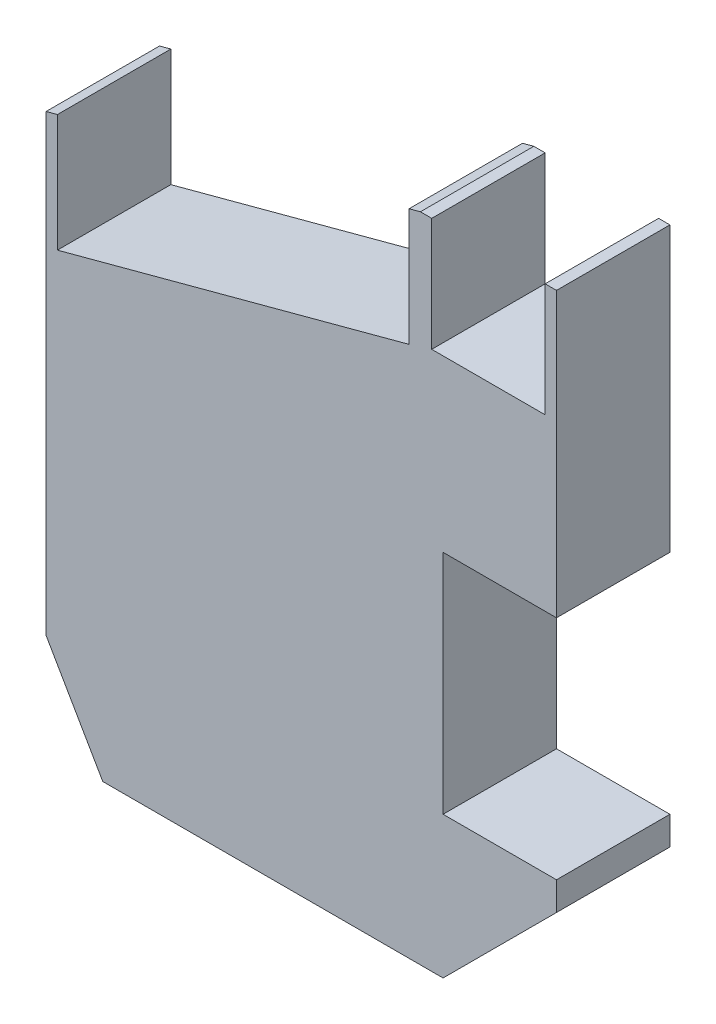
ISO-10303-21;
HEADER;
FILE_DESCRIPTION(('STEP AP214'),'2;1');
FILE_NAME('part.step','',(''),(''),'','','');
FILE_SCHEMA(('AUTOMOTIVE_DESIGN { 1 0 10303 214 1 1 1 1 }'));
ENDSEC;
DATA;
#1=APPLICATION_CONTEXT('core data for automotive mechanical design processes');
#2=APPLICATION_PROTOCOL_DEFINITION('international standard','automotive_design',2000,#1);
#3=PRODUCT_CONTEXT('',#1,'mechanical');
#4=PRODUCT('Part','Part','',(#3));
#5=PRODUCT_RELATED_PRODUCT_CATEGORY('part','',(#4));
#6=PRODUCT_DEFINITION_FORMATION('','',#4);
#7=PRODUCT_DEFINITION_CONTEXT('part definition',#1,'design');
#8=PRODUCT_DEFINITION('design','',#6,#7);
#9=PRODUCT_DEFINITION_SHAPE('','',#8);
#10=(LENGTH_UNIT() NAMED_UNIT(*) SI_UNIT(.MILLI.,.METRE.));
#11=(NAMED_UNIT(*) PLANE_ANGLE_UNIT() SI_UNIT($,.RADIAN.));
#12=(NAMED_UNIT(*) SI_UNIT($,.STERADIAN.) SOLID_ANGLE_UNIT());
#13=UNCERTAINTY_MEASURE_WITH_UNIT(LENGTH_MEASURE(1.E-05),#10,'distance_accuracy_value','');
#14=(GEOMETRIC_REPRESENTATION_CONTEXT(3) GLOBAL_UNCERTAINTY_ASSIGNED_CONTEXT((#13)) GLOBAL_UNIT_ASSIGNED_CONTEXT((#10,
#11,#12)) REPRESENTATION_CONTEXT('',''));
#15=CARTESIAN_POINT('',(0.,0.,0.));
#16=DIRECTION('',(0.,0.,1.));
#17=DIRECTION('',(1.,0.,0.));
#18=AXIS2_PLACEMENT_3D('',#15,#16,#17);
#19=CARTESIAN_POINT('',(0.,0.,20.));
#20=DIRECTION('',(0.,0.,1.));
#21=DIRECTION('',(1.,0.,0.));
#22=AXIS2_PLACEMENT_3D('',#19,#20,#21);
#23=PLANE('',#22);
#24=DIRECTION('',(0.965925826289068,0.258819045102521,0.));
#25=VECTOR('',#24,1.);
#26=CARTESIAN_POINT('',(-24.9987113059643,93.2964607176053,20.));
#27=LINE('',#26,#25);
#28=CARTESIAN_POINT('',(53.9999999999999,114.464101615138,20.));
#29=VERTEX_POINT('',#28);
#30=CARTESIAN_POINT('',(55.9999999999999,115.,20.));
#31=VERTEX_POINT('',#30);
#32=EDGE_CURVE('E263',#29,#31,#27,.T.);
#33=ORIENTED_EDGE('',*,*,#32,.F.);
#34=DIRECTION('',(0.,-1.,0.));
#35=VECTOR('',#34,1.);
#36=CARTESIAN_POINT('',(54.,0.,20.));
#37=LINE('',#36,#35);
#38=CARTESIAN_POINT('',(53.9999999999999,93.7585780069361,20.));
#39=VERTEX_POINT('',#38);
#40=EDGE_CURVE('E208',#29,#39,#37,.T.);
#41=ORIENTED_EDGE('',*,*,#40,.T.);
#42=DIRECTION('',(-0.965925826289068,-0.258819045102521,0.));
#43=VECTOR('',#42,1.);
#44=CARTESIAN_POINT('',(-19.8223304039139,73.9779441918239,20.));
#45=LINE('',#44,#43);
#46=CARTESIAN_POINT('',(-8.00000000000008,77.1457280762065,20.));
#47=VERTEX_POINT('',#46);
#48=EDGE_CURVE('E174',#39,#47,#45,.T.);
#49=ORIENTED_EDGE('',*,*,#48,.T.);
#50=DIRECTION('',(0.,1.,0.));
#51=VECTOR('',#50,1.);
#52=CARTESIAN_POINT('',(-8.00000000000007,0.,20.));
#53=LINE('',#52,#51);
#54=CARTESIAN_POINT('',(-8.00000000000008,97.8512516844082,20.));
#55=VERTEX_POINT('',#54);
#56=EDGE_CURVE('E177',#47,#55,#53,.T.);
#57=ORIENTED_EDGE('',*,*,#56,.T.);
#58=CARTESIAN_POINT('',(-10.0000000000001,97.3153532995459,20.));
#59=VERTEX_POINT('',#58);
#60=EDGE_CURVE('E264',#59,#55,#27,.T.);
#61=ORIENTED_EDGE('',*,*,#60,.F.);
#62=DIRECTION('',(0.,-1.,0.));
#63=VECTOR('',#62,1.);
#64=CARTESIAN_POINT('',(-10.0000000000001,0.,20.));
#65=LINE('',#64,#63);
#66=CARTESIAN_POINT('',(-10.0000000000001,17.3153532995459,20.));
#67=VERTEX_POINT('',#66);
#68=EDGE_CURVE('E245',#59,#67,#65,.T.);
#69=ORIENTED_EDGE('',*,*,#68,.T.);
#70=DIRECTION('',(0.5001116249392,-0.865960947503219,0.));
#71=VECTOR('',#70,1.);
#72=CARTESIAN_POINT('',(0.,0.,20.));
#73=LINE('',#72,#71);
#74=CARTESIAN_POINT('',(0.,0.,20.));
#75=VERTEX_POINT('',#74);
#76=EDGE_CURVE('E248',#67,#75,#73,.T.);
#77=ORIENTED_EDGE('',*,*,#76,.T.);
#78=DIRECTION('',(1.,0.,0.));
#79=VECTOR('',#78,1.);
#80=CARTESIAN_POINT('',(0.,0.,20.));
#81=LINE('',#80,#79);
#82=CARTESIAN_POINT('',(60.,0.,20.));
#83=VERTEX_POINT('',#82);
#84=EDGE_CURVE('E251',#75,#83,#81,.T.);
#85=ORIENTED_EDGE('',*,*,#84,.T.);
#86=DIRECTION('',(0.707106781186546,0.707106781186549,0.));
#87=VECTOR('',#86,1.);
#88=CARTESIAN_POINT('',(30.0000000000001,-30.,20.));
#89=LINE('',#88,#87);
#90=CARTESIAN_POINT('',(79.9999999999999,20.,20.));
#91=VERTEX_POINT('',#90);
#92=EDGE_CURVE('E253',#83,#91,#89,.T.);
#93=ORIENTED_EDGE('',*,*,#92,.T.);
#94=DIRECTION('',(0.,1.,0.));
#95=VECTOR('',#94,1.);
#96=CARTESIAN_POINT('',(79.9999999999999,0.,20.));
#97=LINE('',#96,#95);
#98=CARTESIAN_POINT('',(79.9999999999999,25.,20.));
#99=VERTEX_POINT('',#98);
#100=EDGE_CURVE('E256',#91,#99,#97,.T.);
#101=ORIENTED_EDGE('',*,*,#100,.T.);
#102=DIRECTION('',(1.,0.,0.));
#103=VECTOR('',#102,1.);
#104=CARTESIAN_POINT('',(0.,25.,20.));
#105=LINE('',#104,#103);
#106=CARTESIAN_POINT('',(59.9999999999999,25.,20.));
#107=VERTEX_POINT('',#106);
#108=EDGE_CURVE('E50',#107,#99,#105,.T.);
#109=ORIENTED_EDGE('',*,*,#108,.F.);
#110=DIRECTION('',(0.,-1.,0.));
#111=VECTOR('',#110,1.);
#112=CARTESIAN_POINT('',(59.9999999999999,0.,20.));
#113=LINE('',#112,#111);
#114=CARTESIAN_POINT('',(59.9999999999999,65.,20.));
#115=VERTEX_POINT('',#114);
#116=EDGE_CURVE('E213',#115,#107,#113,.T.);
#117=ORIENTED_EDGE('',*,*,#116,.F.);
#118=DIRECTION('',(-1.,0.,0.));
#119=VECTOR('',#118,1.);
#120=CARTESIAN_POINT('',(0.,65.,20.));
#121=LINE('',#120,#119);
#122=CARTESIAN_POINT('',(79.9999999999999,65.,20.));
#123=VERTEX_POINT('',#122);
#124=EDGE_CURVE('E211',#123,#115,#121,.T.);
#125=ORIENTED_EDGE('',*,*,#124,.F.);
#126=CARTESIAN_POINT('',(79.9999999999999,115.,20.));
#127=VERTEX_POINT('',#126);
#128=EDGE_CURVE('E255',#123,#127,#97,.T.);
#129=ORIENTED_EDGE('',*,*,#128,.T.);
#130=DIRECTION('',(-1.,0.,0.));
#131=VECTOR('',#130,1.);
#132=CARTESIAN_POINT('',(0.,115.,20.));
#133=LINE('',#132,#131);
#134=CARTESIAN_POINT('',(77.9999999999999,115.,20.));
#135=VERTEX_POINT('',#134);
#136=EDGE_CURVE('E260',#127,#135,#133,.T.);
#137=ORIENTED_EDGE('',*,*,#136,.T.);
#138=DIRECTION('',(0.,-1.,0.));
#139=VECTOR('',#138,1.);
#140=CARTESIAN_POINT('',(77.9999999999999,0.,20.));
#141=LINE('',#140,#139);
#142=CARTESIAN_POINT('',(77.9999999999999,95.,20.));
#143=VERTEX_POINT('',#142);
#144=EDGE_CURVE('E238',#135,#143,#141,.T.);
#145=ORIENTED_EDGE('',*,*,#144,.T.);
#146=DIRECTION('',(-1.,0.,0.));
#147=VECTOR('',#146,1.);
#148=CARTESIAN_POINT('',(0.,95.,20.));
#149=LINE('',#148,#147);
#150=CARTESIAN_POINT('',(57.9999999999999,95.,20.));
#151=VERTEX_POINT('',#150);
#152=EDGE_CURVE('E241',#143,#151,#149,.T.);
#153=ORIENTED_EDGE('',*,*,#152,.T.);
#154=DIRECTION('',(0.,1.,0.));
#155=VECTOR('',#154,1.);
#156=CARTESIAN_POINT('',(57.9999999999999,0.,20.));
#157=LINE('',#156,#155);
#158=CARTESIAN_POINT('',(57.9999999999999,115.,20.));
#159=VERTEX_POINT('',#158);
#160=EDGE_CURVE('E235',#151,#159,#157,.T.);
#161=ORIENTED_EDGE('',*,*,#160,.T.);
#162=EDGE_CURVE('E259',#159,#31,#133,.T.);
#163=ORIENTED_EDGE('',*,*,#162,.T.);
#164=EDGE_LOOP('',(#33,#41,#49,#57,#61,#69,#77,#85,#93,#101,#109,#117,#125,#129,#137,#145,#153,
#161,#163));
#165=FACE_BOUND('',#164,.T.);
#166=ADVANCED_FACE('F35',(#165),#23,.T.);
#167=CARTESIAN_POINT('',(0.,0.,0.));
#168=DIRECTION('',(0.,0.,1.));
#169=DIRECTION('',(1.,0.,0.));
#170=AXIS2_PLACEMENT_3D('',#167,#168,#169);
#171=PLANE('',#170);
#172=DIRECTION('',(0.,1.,0.));
#173=VECTOR('',#172,1.);
#174=CARTESIAN_POINT('',(54.,0.,0.));
#175=LINE('',#174,#173);
#176=CARTESIAN_POINT('',(53.9999999999999,93.7585780069361,0.));
#177=VERTEX_POINT('',#176);
#178=CARTESIAN_POINT('',(53.9999999999999,114.464101615138,0.));
#179=VERTEX_POINT('',#178);
#180=EDGE_CURVE('E181',#177,#179,#175,.T.);
#181=ORIENTED_EDGE('',*,*,#180,.T.);
#182=DIRECTION('',(0.965925826289068,0.258819045102521,0.));
#183=VECTOR('',#182,1.);
#184=CARTESIAN_POINT('',(-24.9987113059643,93.2964607176053,0.));
#185=LINE('',#184,#183);
#186=CARTESIAN_POINT('',(55.9999999999999,115.,0.));
#187=VERTEX_POINT('',#186);
#188=EDGE_CURVE('E284',#179,#187,#185,.T.);
#189=ORIENTED_EDGE('',*,*,#188,.T.);
#190=DIRECTION('',(-1.,0.,0.));
#191=VECTOR('',#190,1.);
#192=CARTESIAN_POINT('',(0.,115.,0.));
#193=LINE('',#192,#191);
#194=CARTESIAN_POINT('',(57.9999999999999,115.,0.));
#195=VERTEX_POINT('',#194);
#196=EDGE_CURVE('E280',#195,#187,#193,.T.);
#197=ORIENTED_EDGE('',*,*,#196,.F.);
#198=DIRECTION('',(0.,-1.,0.));
#199=VECTOR('',#198,1.);
#200=CARTESIAN_POINT('',(57.9999999999999,0.,0.));
#201=LINE('',#200,#199);
#202=CARTESIAN_POINT('',(57.9999999999999,95.,0.));
#203=VERTEX_POINT('',#202);
#204=EDGE_CURVE('E222',#195,#203,#201,.T.);
#205=ORIENTED_EDGE('',*,*,#204,.T.);
#206=DIRECTION('',(1.,0.,0.));
#207=VECTOR('',#206,1.);
#208=CARTESIAN_POINT('',(0.,95.,0.));
#209=LINE('',#208,#207);
#210=CARTESIAN_POINT('',(77.9999999999999,95.,0.));
#211=VERTEX_POINT('',#210);
#212=EDGE_CURVE('E216',#203,#211,#209,.T.);
#213=ORIENTED_EDGE('',*,*,#212,.T.);
#214=DIRECTION('',(0.,1.,0.));
#215=VECTOR('',#214,1.);
#216=CARTESIAN_POINT('',(77.9999999999999,0.,0.));
#217=LINE('',#216,#215);
#218=CARTESIAN_POINT('',(77.9999999999999,115.,0.));
#219=VERTEX_POINT('',#218);
#220=EDGE_CURVE('E219',#211,#219,#217,.T.);
#221=ORIENTED_EDGE('',*,*,#220,.T.);
#222=CARTESIAN_POINT('',(79.9999999999999,115.,0.));
#223=VERTEX_POINT('',#222);
#224=EDGE_CURVE('E281',#223,#219,#193,.T.);
#225=ORIENTED_EDGE('',*,*,#224,.F.);
#226=DIRECTION('',(0.,1.,0.));
#227=VECTOR('',#226,1.);
#228=CARTESIAN_POINT('',(79.9999999999999,0.,0.));
#229=LINE('',#228,#227);
#230=CARTESIAN_POINT('',(79.9999999999999,65.,0.));
#231=VERTEX_POINT('',#230);
#232=EDGE_CURVE('E276',#231,#223,#229,.T.);
#233=ORIENTED_EDGE('',*,*,#232,.F.);
#234=DIRECTION('',(1.,0.,0.));
#235=VECTOR('',#234,1.);
#236=CARTESIAN_POINT('',(0.,65.,0.));
#237=LINE('',#236,#235);
#238=CARTESIAN_POINT('',(59.9999999999999,65.,0.));
#239=VERTEX_POINT('',#238);
#240=EDGE_CURVE('E197',#239,#231,#237,.T.);
#241=ORIENTED_EDGE('',*,*,#240,.F.);
#242=DIRECTION('',(0.,1.,0.));
#243=VECTOR('',#242,1.);
#244=CARTESIAN_POINT('',(59.9999999999999,0.,0.));
#245=LINE('',#244,#243);
#246=CARTESIAN_POINT('',(59.9999999999999,25.,0.));
#247=VERTEX_POINT('',#246);
#248=EDGE_CURVE('E199',#247,#239,#245,.T.);
#249=ORIENTED_EDGE('',*,*,#248,.F.);
#250=DIRECTION('',(-1.,0.,0.));
#251=VECTOR('',#250,1.);
#252=CARTESIAN_POINT('',(0.,25.,0.));
#253=LINE('',#252,#251);
#254=CARTESIAN_POINT('',(79.9999999999999,25.,0.));
#255=VERTEX_POINT('',#254);
#256=EDGE_CURVE('E202',#255,#247,#253,.T.);
#257=ORIENTED_EDGE('',*,*,#256,.F.);
#258=CARTESIAN_POINT('',(79.9999999999999,20.,0.));
#259=VERTEX_POINT('',#258);
#260=EDGE_CURVE('E277',#259,#255,#229,.T.);
#261=ORIENTED_EDGE('',*,*,#260,.F.);
#262=DIRECTION('',(0.707106781186546,0.707106781186549,0.));
#263=VECTOR('',#262,1.);
#264=CARTESIAN_POINT('',(30.0000000000001,-30.,0.));
#265=LINE('',#264,#263);
#266=CARTESIAN_POINT('',(60.,0.,0.));
#267=VERTEX_POINT('',#266);
#268=EDGE_CURVE('E274',#267,#259,#265,.T.);
#269=ORIENTED_EDGE('',*,*,#268,.F.);
#270=DIRECTION('',(1.,0.,0.));
#271=VECTOR('',#270,1.);
#272=CARTESIAN_POINT('',(0.,0.,0.));
#273=LINE('',#272,#271);
#274=CARTESIAN_POINT('',(0.,0.,0.));
#275=VERTEX_POINT('',#274);
#276=EDGE_CURVE('E272',#275,#267,#273,.T.);
#277=ORIENTED_EDGE('',*,*,#276,.F.);
#278=DIRECTION('',(0.5001116249392,-0.865960947503219,0.));
#279=VECTOR('',#278,1.);
#280=CARTESIAN_POINT('',(0.,0.,0.));
#281=LINE('',#280,#279);
#282=CARTESIAN_POINT('',(-10.0000000000001,17.3153532995459,0.));
#283=VERTEX_POINT('',#282);
#284=EDGE_CURVE('E270',#283,#275,#281,.T.);
#285=ORIENTED_EDGE('',*,*,#284,.F.);
#286=DIRECTION('',(0.,-1.,0.));
#287=VECTOR('',#286,1.);
#288=CARTESIAN_POINT('',(-10.0000000000001,0.,0.));
#289=LINE('',#288,#287);
#290=CARTESIAN_POINT('',(-10.0000000000001,97.3153532995459,0.));
#291=VERTEX_POINT('',#290);
#292=EDGE_CURVE('E244',#291,#283,#289,.T.);
#293=ORIENTED_EDGE('',*,*,#292,.F.);
#294=CARTESIAN_POINT('',(-8.00000000000008,97.8512516844082,0.));
#295=VERTEX_POINT('',#294);
#296=EDGE_CURVE('E249',#291,#295,#185,.T.);
#297=ORIENTED_EDGE('',*,*,#296,.T.);
#298=DIRECTION('',(0.,-1.,0.));
#299=VECTOR('',#298,1.);
#300=CARTESIAN_POINT('',(-8.00000000000007,0.,0.));
#301=LINE('',#300,#299);
#302=CARTESIAN_POINT('',(-8.00000000000008,77.1457280762065,0.));
#303=VERTEX_POINT('',#302);
#304=EDGE_CURVE('E58',#295,#303,#301,.T.);
#305=ORIENTED_EDGE('',*,*,#304,.T.);
#306=DIRECTION('',(0.965925826289068,0.258819045102521,0.));
#307=VECTOR('',#306,1.);
#308=CARTESIAN_POINT('',(-19.8223304039139,73.9779441918239,0.));
#309=LINE('',#308,#307);
#310=EDGE_CURVE('E172',#303,#177,#309,.T.);
#311=ORIENTED_EDGE('',*,*,#310,.T.);
#312=EDGE_LOOP('',(#181,#189,#197,#205,#213,#221,#225,#233,#241,#249,#257,#261,#269,#277,#285,
#293,#297,#305,#311));
#313=FACE_BOUND('',#312,.T.);
#314=ADVANCED_FACE('F188',(#313),#171,.F.);
#315=CARTESIAN_POINT('',(79.9999999999999,0.,20.));
#316=DIRECTION('',(-1.,0.,0.));
#317=DIRECTION('',(0.,0.,1.));
#318=AXIS2_PLACEMENT_3D('',#315,#316,#317);
#319=PLANE('',#318);
#320=ORIENTED_EDGE('',*,*,#128,.F.);
#321=DIRECTION('',(0.,0.,-1.));
#322=VECTOR('',#321,1.);
#323=CARTESIAN_POINT('',(79.9999999999999,65.,20.));
#324=LINE('',#323,#322);
#325=EDGE_CURVE('E11',#123,#231,#324,.T.);
#326=ORIENTED_EDGE('',*,*,#325,.T.);
#327=ORIENTED_EDGE('',*,*,#232,.T.);
#328=DIRECTION('',(0.,0.,-1.));
#329=VECTOR('',#328,1.);
#330=CARTESIAN_POINT('',(79.9999999999999,115.,20.));
#331=LINE('',#330,#329);
#332=EDGE_CURVE('E290',#127,#223,#331,.T.);
#333=ORIENTED_EDGE('',*,*,#332,.F.);
#334=EDGE_LOOP('',(#320,#326,#327,#333));
#335=FACE_BOUND('',#334,.T.);
#336=ADVANCED_FACE('F334',(#335),#319,.F.);
#337=CARTESIAN_POINT('',(-24.9987113059643,93.2964607176053,20.));
#338=DIRECTION('',(-0.258819045102521,0.965925826289068,0.));
#339=DIRECTION('',(-0.965925826289068,-0.258819045102521,0.));
#340=AXIS2_PLACEMENT_3D('',#337,#338,#339);
#341=PLANE('',#340);
#342=ORIENTED_EDGE('',*,*,#188,.F.);
#343=DIRECTION('',(0.,0.,1.));
#344=VECTOR('',#343,1.);
#345=CARTESIAN_POINT('',(53.9999999999999,114.464101615138,20.));
#346=LINE('',#345,#344);
#347=EDGE_CURVE('E184',#179,#29,#346,.T.);
#348=ORIENTED_EDGE('',*,*,#347,.T.);
#349=ORIENTED_EDGE('',*,*,#32,.T.);
#350=DIRECTION('',(0.,0.,-1.));
#351=VECTOR('',#350,1.);
#352=CARTESIAN_POINT('',(55.9999999999999,115.,20.));
#353=LINE('',#352,#351);
#354=EDGE_CURVE('E287',#31,#187,#353,.T.);
#355=ORIENTED_EDGE('',*,*,#354,.T.);
#356=EDGE_LOOP('',(#342,#348,#349,#355));
#357=FACE_BOUND('',#356,.T.);
#358=ADVANCED_FACE('F357',(#357),#341,.T.);
#359=ORIENTED_EDGE('',*,*,#60,.T.);
#360=DIRECTION('',(0.,0.,-1.));
#361=VECTOR('',#360,1.);
#362=CARTESIAN_POINT('',(-8.00000000000008,97.8512516844082,20.));
#363=LINE('',#362,#361);
#364=EDGE_CURVE('E305',#55,#295,#363,.T.);
#365=ORIENTED_EDGE('',*,*,#364,.T.);
#366=ORIENTED_EDGE('',*,*,#296,.F.);
#367=DIRECTION('',(0.,0.,-1.));
#368=VECTOR('',#367,1.);
#369=CARTESIAN_POINT('',(-10.0000000000001,97.3153532995459,20.));
#370=LINE('',#369,#368);
#371=EDGE_CURVE('E267',#59,#291,#370,.T.);
#372=ORIENTED_EDGE('',*,*,#371,.F.);
#373=EDGE_LOOP('',(#359,#365,#366,#372));
#374=FACE_BOUND('',#373,.T.);
#375=ADVANCED_FACE('F361',(#374),#341,.T.);
#376=CARTESIAN_POINT('',(0.,115.,20.));
#377=DIRECTION('',(0.,-1.,0.));
#378=DIRECTION('',(0.,0.,-1.));
#379=AXIS2_PLACEMENT_3D('',#376,#377,#378);
#380=PLANE('',#379);
#381=DIRECTION('',(0.,0.,-1.));
#382=VECTOR('',#381,1.);
#383=CARTESIAN_POINT('',(77.9999999999999,115.,20.000012));
#384=LINE('',#383,#382);
#385=EDGE_CURVE('E231',#135,#219,#384,.T.);
#386=ORIENTED_EDGE('',*,*,#385,.F.);
#387=ORIENTED_EDGE('',*,*,#136,.F.);
#388=ORIENTED_EDGE('',*,*,#332,.T.);
#389=ORIENTED_EDGE('',*,*,#224,.T.);
#390=EDGE_LOOP('',(#386,#387,#388,#389));
#391=FACE_BOUND('',#390,.T.);
#392=ADVANCED_FACE('F340',(#391),#380,.F.);
#393=DIRECTION('',(0.,0.,-1.));
#394=VECTOR('',#393,1.);
#395=CARTESIAN_POINT('',(57.9999999999999,115.,20.000012));
#396=LINE('',#395,#394);
#397=EDGE_CURVE('E228',#159,#195,#396,.T.);
#398=ORIENTED_EDGE('',*,*,#397,.T.);
#399=ORIENTED_EDGE('',*,*,#196,.T.);
#400=ORIENTED_EDGE('',*,*,#354,.F.);
#401=ORIENTED_EDGE('',*,*,#162,.F.);
#402=EDGE_LOOP('',(#398,#399,#400,#401));
#403=FACE_BOUND('',#402,.T.);
#404=ADVANCED_FACE('F354',(#403),#380,.F.);
#405=CARTESIAN_POINT('',(-10.0000000000001,0.,20.));
#406=DIRECTION('',(1.,0.,0.));
#407=DIRECTION('',(0.,1.,0.));
#408=AXIS2_PLACEMENT_3D('',#405,#406,#407);
#409=PLANE('',#408);
#410=ORIENTED_EDGE('',*,*,#292,.T.);
#411=DIRECTION('',(0.,0.,-1.));
#412=VECTOR('',#411,1.);
#413=CARTESIAN_POINT('',(-10.0000000000001,17.3153532995459,20.));
#414=LINE('',#413,#412);
#415=EDGE_CURVE('E302',#67,#283,#414,.T.);
#416=ORIENTED_EDGE('',*,*,#415,.F.);
#417=ORIENTED_EDGE('',*,*,#68,.F.);
#418=ORIENTED_EDGE('',*,*,#371,.T.);
#419=EDGE_LOOP('',(#410,#416,#417,#418));
#420=FACE_BOUND('',#419,.T.);
#421=ADVANCED_FACE('F37',(#420),#409,.F.);
#422=CARTESIAN_POINT('',(0.,0.,20.));
#423=DIRECTION('',(0.865960947503219,0.5001116249392,0.));
#424=DIRECTION('',(-0.5001116249392,0.865960947503219,0.));
#425=AXIS2_PLACEMENT_3D('',#422,#423,#424);
#426=PLANE('',#425);
#427=ORIENTED_EDGE('',*,*,#284,.T.);
#428=DIRECTION('',(0.,0.,-1.));
#429=VECTOR('',#428,1.);
#430=CARTESIAN_POINT('',(0.,0.,20.));
#431=LINE('',#430,#429);
#432=EDGE_CURVE('E299',#75,#275,#431,.T.);
#433=ORIENTED_EDGE('',*,*,#432,.F.);
#434=ORIENTED_EDGE('',*,*,#76,.F.);
#435=ORIENTED_EDGE('',*,*,#415,.T.);
#436=EDGE_LOOP('',(#427,#433,#434,#435));
#437=FACE_BOUND('',#436,.T.);
#438=ADVANCED_FACE('F369',(#437),#426,.F.);
#439=CARTESIAN_POINT('',(0.,0.,20.));
#440=DIRECTION('',(0.,1.,0.));
#441=DIRECTION('',(0.,0.,1.));
#442=AXIS2_PLACEMENT_3D('',#439,#440,#441);
#443=PLANE('',#442);
#444=ORIENTED_EDGE('',*,*,#276,.T.);
#445=DIRECTION('',(0.,0.,-1.));
#446=VECTOR('',#445,1.);
#447=CARTESIAN_POINT('',(60.,0.,20.));
#448=LINE('',#447,#446);
#449=EDGE_CURVE('E296',#83,#267,#448,.T.);
#450=ORIENTED_EDGE('',*,*,#449,.F.);
#451=ORIENTED_EDGE('',*,*,#84,.F.);
#452=ORIENTED_EDGE('',*,*,#432,.T.);
#453=EDGE_LOOP('',(#444,#450,#451,#452));
#454=FACE_BOUND('',#453,.T.);
#455=ADVANCED_FACE('F371',(#454),#443,.F.);
#456=CARTESIAN_POINT('',(30.0000000000001,-30.,20.));
#457=DIRECTION('',(-0.707106781186549,0.707106781186546,0.));
#458=DIRECTION('',(-0.707106781186546,-0.707106781186549,0.));
#459=AXIS2_PLACEMENT_3D('',#456,#457,#458);
#460=PLANE('',#459);
#461=ORIENTED_EDGE('',*,*,#268,.T.);
#462=DIRECTION('',(0.,0.,-1.));
#463=VECTOR('',#462,1.);
#464=CARTESIAN_POINT('',(79.9999999999999,20.,20.));
#465=LINE('',#464,#463);
#466=EDGE_CURVE('E293',#91,#259,#465,.T.);
#467=ORIENTED_EDGE('',*,*,#466,.F.);
#468=ORIENTED_EDGE('',*,*,#92,.F.);
#469=ORIENTED_EDGE('',*,*,#449,.T.);
#470=EDGE_LOOP('',(#461,#467,#468,#469));
#471=FACE_BOUND('',#470,.T.);
#472=ADVANCED_FACE('F320',(#471),#460,.F.);
#473=ORIENTED_EDGE('',*,*,#260,.T.);
#474=DIRECTION('',(0.,0.,1.));
#475=VECTOR('',#474,1.);
#476=CARTESIAN_POINT('',(79.9999999999999,25.,20.));
#477=LINE('',#476,#475);
#478=EDGE_CURVE('E43',#255,#99,#477,.T.);
#479=ORIENTED_EDGE('',*,*,#478,.T.);
#480=ORIENTED_EDGE('',*,*,#100,.F.);
#481=ORIENTED_EDGE('',*,*,#466,.T.);
#482=EDGE_LOOP('',(#473,#479,#480,#481));
#483=FACE_BOUND('',#482,.T.);
#484=ADVANCED_FACE('F309',(#483),#319,.F.);
#485=CARTESIAN_POINT('',(0.,95.,20.000012));
#486=DIRECTION('',(0.,1.,0.));
#487=DIRECTION('',(0.,0.,1.));
#488=AXIS2_PLACEMENT_3D('',#485,#486,#487);
#489=PLANE('',#488);
#490=DIRECTION('',(0.,0.,-1.));
#491=VECTOR('',#490,1.);
#492=CARTESIAN_POINT('',(77.9999999999999,95.,20.000012));
#493=LINE('',#492,#491);
#494=EDGE_CURVE('E233',#143,#211,#493,.T.);
#495=ORIENTED_EDGE('',*,*,#494,.T.);
#496=ORIENTED_EDGE('',*,*,#212,.F.);
#497=DIRECTION('',(0.,0.,-1.));
#498=VECTOR('',#497,1.);
#499=CARTESIAN_POINT('',(57.9999999999999,95.,20.000012));
#500=LINE('',#499,#498);
#501=EDGE_CURVE('E225',#151,#203,#500,.T.);
#502=ORIENTED_EDGE('',*,*,#501,.F.);
#503=ORIENTED_EDGE('',*,*,#152,.F.);
#504=EDGE_LOOP('',(#495,#496,#502,#503));
#505=FACE_BOUND('',#504,.T.);
#506=ADVANCED_FACE('F346',(#505),#489,.T.);
#507=CARTESIAN_POINT('',(77.9999999999999,0.,20.000012));
#508=DIRECTION('',(-1.,0.,0.));
#509=DIRECTION('',(0.,0.,1.));
#510=AXIS2_PLACEMENT_3D('',#507,#508,#509);
#511=PLANE('',#510);
#512=ORIENTED_EDGE('',*,*,#385,.T.);
#513=ORIENTED_EDGE('',*,*,#220,.F.);
#514=ORIENTED_EDGE('',*,*,#494,.F.);
#515=ORIENTED_EDGE('',*,*,#144,.F.);
#516=EDGE_LOOP('',(#512,#513,#514,#515));
#517=FACE_BOUND('',#516,.T.);
#518=ADVANCED_FACE('F343',(#517),#511,.T.);
#519=CARTESIAN_POINT('',(57.9999999999999,0.,20.000012));
#520=DIRECTION('',(1.,0.,0.));
#521=DIRECTION('',(0.,0.,-1.));
#522=AXIS2_PLACEMENT_3D('',#519,#520,#521);
#523=PLANE('',#522);
#524=ORIENTED_EDGE('',*,*,#501,.T.);
#525=ORIENTED_EDGE('',*,*,#204,.F.);
#526=ORIENTED_EDGE('',*,*,#397,.F.);
#527=ORIENTED_EDGE('',*,*,#160,.F.);
#528=EDGE_LOOP('',(#524,#525,#526,#527));
#529=FACE_BOUND('',#528,.T.);
#530=ADVANCED_FACE('F349',(#529),#523,.T.);
#531=CARTESIAN_POINT('',(-19.8223304039139,73.9779441918239,20.000012));
#532=DIRECTION('',(-0.258819045102521,0.965925826289068,0.));
#533=DIRECTION('',(-0.965925826289068,-0.258819045102521,0.));
#534=AXIS2_PLACEMENT_3D('',#531,#532,#533);
#535=PLANE('',#534);
#536=DIRECTION('',(0.,0.,-1.));
#537=VECTOR('',#536,1.);
#538=CARTESIAN_POINT('',(53.9999999999999,93.7585780069361,20.000012));
#539=LINE('',#538,#537);
#540=EDGE_CURVE('E167',#39,#177,#539,.T.);
#541=ORIENTED_EDGE('',*,*,#540,.T.);
#542=ORIENTED_EDGE('',*,*,#310,.F.);
#543=DIRECTION('',(0.,0.,-1.));
#544=VECTOR('',#543,1.);
#545=CARTESIAN_POINT('',(-8.00000000000008,77.1457280762065,20.000012));
#546=LINE('',#545,#544);
#547=EDGE_CURVE('E178',#47,#303,#546,.T.);
#548=ORIENTED_EDGE('',*,*,#547,.F.);
#549=ORIENTED_EDGE('',*,*,#48,.F.);
#550=EDGE_LOOP('',(#541,#542,#548,#549));
#551=FACE_BOUND('',#550,.T.);
#552=ADVANCED_FACE('F169',(#551),#535,.T.);
#553=CARTESIAN_POINT('',(54.,0.,20.000012));
#554=DIRECTION('',(-1.,0.,0.));
#555=DIRECTION('',(0.,-1.,0.));
#556=AXIS2_PLACEMENT_3D('',#553,#554,#555);
#557=PLANE('',#556);
#558=ORIENTED_EDGE('',*,*,#347,.F.);
#559=ORIENTED_EDGE('',*,*,#180,.F.);
#560=ORIENTED_EDGE('',*,*,#540,.F.);
#561=ORIENTED_EDGE('',*,*,#40,.F.);
#562=EDGE_LOOP('',(#558,#559,#560,#561));
#563=FACE_BOUND('',#562,.T.);
#564=ADVANCED_FACE('F182',(#563),#557,.T.);
#565=CARTESIAN_POINT('',(-8.00000000000007,0.,20.000012));
#566=DIRECTION('',(1.,0.,0.));
#567=DIRECTION('',(0.,1.,0.));
#568=AXIS2_PLACEMENT_3D('',#565,#566,#567);
#569=PLANE('',#568);
#570=ORIENTED_EDGE('',*,*,#547,.T.);
#571=ORIENTED_EDGE('',*,*,#304,.F.);
#572=ORIENTED_EDGE('',*,*,#364,.F.);
#573=ORIENTED_EDGE('',*,*,#56,.F.);
#574=EDGE_LOOP('',(#570,#571,#572,#573));
#575=FACE_BOUND('',#574,.T.);
#576=ADVANCED_FACE('F498',(#575),#569,.T.);
#577=CARTESIAN_POINT('',(0.,65.,20.000012));
#578=DIRECTION('',(0.,1.,0.));
#579=DIRECTION('',(0.,0.,1.));
#580=AXIS2_PLACEMENT_3D('',#577,#578,#579);
#581=PLANE('',#580);
#582=ORIENTED_EDGE('',*,*,#124,.T.);
#583=DIRECTION('',(0.,0.,-1.));
#584=VECTOR('',#583,1.);
#585=CARTESIAN_POINT('',(59.9999999999999,65.,20.000012));
#586=LINE('',#585,#584);
#587=EDGE_CURVE('E190',#115,#239,#586,.T.);
#588=ORIENTED_EDGE('',*,*,#587,.T.);
#589=ORIENTED_EDGE('',*,*,#240,.T.);
#590=ORIENTED_EDGE('',*,*,#325,.F.);
#591=EDGE_LOOP('',(#582,#588,#589,#590));
#592=FACE_BOUND('',#591,.T.);
#593=ADVANCED_FACE('F507',(#592),#581,.F.);
#594=CARTESIAN_POINT('',(59.9999999999999,0.,20.000012));
#595=DIRECTION('',(-1.,0.,0.));
#596=DIRECTION('',(0.,0.,1.));
#597=AXIS2_PLACEMENT_3D('',#594,#595,#596);
#598=PLANE('',#597);
#599=ORIENTED_EDGE('',*,*,#116,.T.);
#600=DIRECTION('',(0.,0.,-1.));
#601=VECTOR('',#600,1.);
#602=CARTESIAN_POINT('',(59.9999999999999,25.,20.000012));
#603=LINE('',#602,#601);
#604=EDGE_CURVE('E192',#107,#247,#603,.T.);
#605=ORIENTED_EDGE('',*,*,#604,.T.);
#606=ORIENTED_EDGE('',*,*,#248,.T.);
#607=ORIENTED_EDGE('',*,*,#587,.F.);
#608=EDGE_LOOP('',(#599,#605,#606,#607));
#609=FACE_BOUND('',#608,.T.);
#610=ADVANCED_FACE('F327',(#609),#598,.F.);
#611=CARTESIAN_POINT('',(0.,25.,20.000012));
#612=DIRECTION('',(0.,-1.,0.));
#613=DIRECTION('',(1.,0.,0.));
#614=AXIS2_PLACEMENT_3D('',#611,#612,#613);
#615=PLANE('',#614);
#616=ORIENTED_EDGE('',*,*,#108,.T.);
#617=ORIENTED_EDGE('',*,*,#478,.F.);
#618=ORIENTED_EDGE('',*,*,#256,.T.);
#619=ORIENTED_EDGE('',*,*,#604,.F.);
#620=EDGE_LOOP('',(#616,#617,#618,#619));
#621=FACE_BOUND('',#620,.T.);
#622=ADVANCED_FACE('F325',(#621),#615,.F.);
#623=CLOSED_SHELL('',(#166,#314,#336,#358,#375,#392,#404,#421,#438,#455,#472,#484,#506,#518,
#530,#552,#564,#576,#593,#610,#622));
#624=MANIFOLD_SOLID_BREP('B2',#623);
#625=ADVANCED_BREP_SHAPE_REPRESENTATION('',(#18,#624),#14);
#626=SHAPE_DEFINITION_REPRESENTATION(#9,#625);
ENDSEC;
END-ISO-10303-21;
